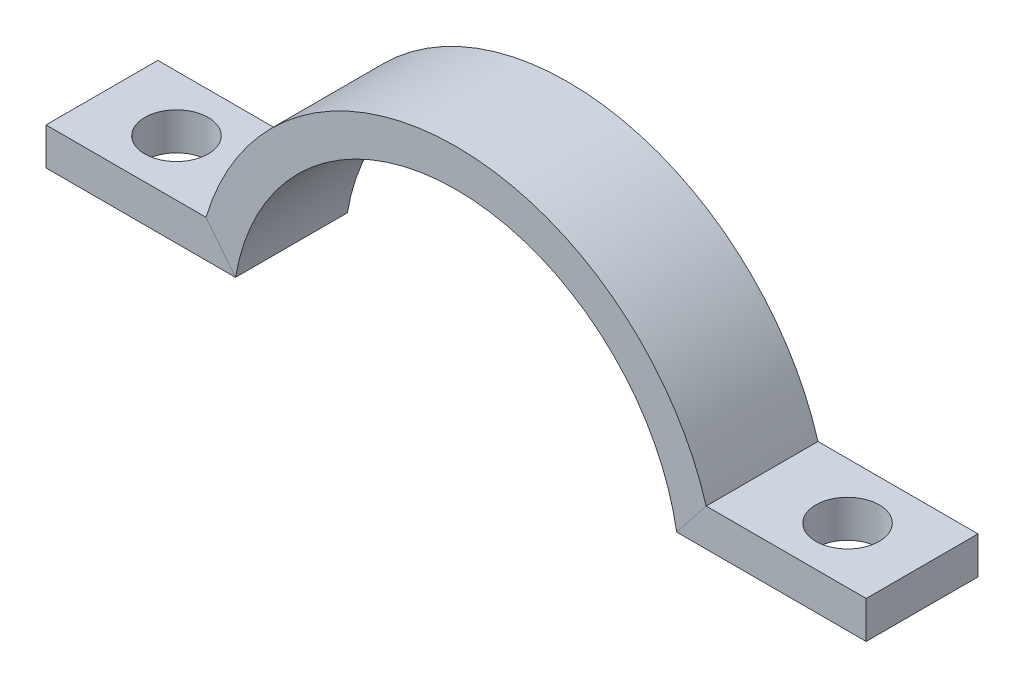
ISO-10303-21;
HEADER;
FILE_DESCRIPTION(('STEP AP214'),'2;1');
FILE_NAME('part.step','',(''),(''),'','','');
FILE_SCHEMA(('AUTOMOTIVE_DESIGN { 1 0 10303 214 1 1 1 1 }'));
ENDSEC;
DATA;
#1=APPLICATION_CONTEXT('core data for automotive mechanical design processes');
#2=APPLICATION_PROTOCOL_DEFINITION('international standard','automotive_design',2000,#1);
#3=PRODUCT_CONTEXT('',#1,'mechanical');
#4=PRODUCT('Part','Part','',(#3));
#5=PRODUCT_RELATED_PRODUCT_CATEGORY('part','',(#4));
#6=PRODUCT_DEFINITION_FORMATION('','',#4);
#7=PRODUCT_DEFINITION_CONTEXT('part definition',#1,'design');
#8=PRODUCT_DEFINITION('design','',#6,#7);
#9=PRODUCT_DEFINITION_SHAPE('','',#8);
#10=(LENGTH_UNIT() NAMED_UNIT(*) SI_UNIT(.MILLI.,.METRE.));
#11=(NAMED_UNIT(*) PLANE_ANGLE_UNIT() SI_UNIT($,.RADIAN.));
#12=(NAMED_UNIT(*) SI_UNIT($,.STERADIAN.) SOLID_ANGLE_UNIT());
#13=UNCERTAINTY_MEASURE_WITH_UNIT(LENGTH_MEASURE(1.E-05),#10,'distance_accuracy_value','');
#14=(GEOMETRIC_REPRESENTATION_CONTEXT(3) GLOBAL_UNCERTAINTY_ASSIGNED_CONTEXT((#13)) GLOBAL_UNIT_ASSIGNED_CONTEXT((#10,
#11,#12)) REPRESENTATION_CONTEXT('',''));
#15=CARTESIAN_POINT('',(0.,0.,0.));
#16=DIRECTION('',(0.,0.,1.));
#17=DIRECTION('',(1.,0.,0.));
#18=AXIS2_PLACEMENT_3D('',#15,#16,#17);
#19=CARTESIAN_POINT('',(22.,0.,0.));
#20=DIRECTION('',(1.,0.,0.));
#21=DIRECTION('',(0.,0.,-1.));
#22=AXIS2_PLACEMENT_3D('',#19,#20,#21);
#23=PLANE('',#22);
#24=DIRECTION('',(0.,-1.,0.));
#25=VECTOR('',#24,1.);
#26=CARTESIAN_POINT('',(22.,2.,3.));
#27=LINE('',#26,#25);
#28=CARTESIAN_POINT('',(22.,4.,3.));
#29=VERTEX_POINT('',#28);
#30=CARTESIAN_POINT('',(22.,2.,3.));
#31=VERTEX_POINT('',#30);
#32=EDGE_CURVE('E82',#29,#31,#27,.T.);
#33=ORIENTED_EDGE('',*,*,#32,.T.);
#34=DIRECTION('',(0.,0.,-1.));
#35=VECTOR('',#34,1.);
#36=CARTESIAN_POINT('',(22.,2.,-3.));
#37=LINE('',#36,#35);
#38=CARTESIAN_POINT('',(22.,2.,-3.));
#39=VERTEX_POINT('',#38);
#40=EDGE_CURVE('E37',#31,#39,#37,.T.);
#41=ORIENTED_EDGE('',*,*,#40,.T.);
#42=DIRECTION('',(0.,1.,0.));
#43=VECTOR('',#42,1.);
#44=CARTESIAN_POINT('',(22.,2.,-3.));
#45=LINE('',#44,#43);
#46=CARTESIAN_POINT('',(22.,4.,-3.));
#47=VERTEX_POINT('',#46);
#48=EDGE_CURVE('E108',#39,#47,#45,.T.);
#49=ORIENTED_EDGE('',*,*,#48,.T.);
#50=DIRECTION('',(0.,0.,1.));
#51=VECTOR('',#50,1.);
#52=CARTESIAN_POINT('',(22.,4.,-3.));
#53=LINE('',#52,#51);
#54=EDGE_CURVE('E80',#47,#29,#53,.T.);
#55=ORIENTED_EDGE('',*,*,#54,.T.);
#56=EDGE_LOOP('',(#33,#41,#49,#55));
#57=FACE_BOUND('',#56,.T.);
#58=ADVANCED_FACE('F34',(#57),#23,.T.);
#59=CARTESIAN_POINT('',(-22.,0.,0.));
#60=DIRECTION('',(1.,0.,0.));
#61=DIRECTION('',(0.,0.,-1.));
#62=AXIS2_PLACEMENT_3D('',#59,#60,#61);
#63=PLANE('',#62);
#64=DIRECTION('',(0.,-1.,0.));
#65=VECTOR('',#64,1.);
#66=CARTESIAN_POINT('',(-22.,1.99999999999999,3.));
#67=LINE('',#66,#65);
#68=CARTESIAN_POINT('',(-22.,3.99999999999999,3.));
#69=VERTEX_POINT('',#68);
#70=CARTESIAN_POINT('',(-22.,1.99999999999999,3.));
#71=VERTEX_POINT('',#70);
#72=EDGE_CURVE('E144',#69,#71,#67,.T.);
#73=ORIENTED_EDGE('',*,*,#72,.F.);
#74=DIRECTION('',(0.,0.,1.));
#75=VECTOR('',#74,1.);
#76=CARTESIAN_POINT('',(-22.,3.99999999999999,-3.));
#77=LINE('',#76,#75);
#78=CARTESIAN_POINT('',(-22.,3.99999999999999,-3.));
#79=VERTEX_POINT('',#78);
#80=EDGE_CURVE('E150',#79,#69,#77,.T.);
#81=ORIENTED_EDGE('',*,*,#80,.F.);
#82=DIRECTION('',(0.,1.,0.));
#83=VECTOR('',#82,1.);
#84=CARTESIAN_POINT('',(-22.,1.99999999999999,-3.));
#85=LINE('',#84,#83);
#86=CARTESIAN_POINT('',(-22.,1.99999999999999,-3.));
#87=VERTEX_POINT('',#86);
#88=EDGE_CURVE('E116',#87,#79,#85,.T.);
#89=ORIENTED_EDGE('',*,*,#88,.F.);
#90=DIRECTION('',(0.,0.,-1.));
#91=VECTOR('',#90,1.);
#92=CARTESIAN_POINT('',(-22.,1.99999999999999,-3.));
#93=LINE('',#92,#91);
#94=EDGE_CURVE('E140',#71,#87,#93,.T.);
#95=ORIENTED_EDGE('',*,*,#94,.F.);
#96=EDGE_LOOP('',(#73,#81,#89,#95));
#97=FACE_BOUND('',#96,.T.);
#98=ADVANCED_FACE('F199',(#97),#63,.F.);
#99=CARTESIAN_POINT('',(11.8321595661992,2.,-3.));
#100=DIRECTION('',(0.,0.,-1.));
#101=DIRECTION('',(0.,1.,0.));
#102=AXIS2_PLACEMENT_3D('',#99,#100,#101);
#103=PLANE('',#102);
#104=DIRECTION('',(-0.620923365895035,-0.783871273670353,0.));
#105=VECTOR('',#104,1.);
#106=CARTESIAN_POINT('',(13.4164078649987,4.,-3.));
#107=LINE('',#106,#105);
#108=CARTESIAN_POINT('',(13.4164078649987,4.,-3.));
#109=VERTEX_POINT('',#108);
#110=CARTESIAN_POINT('',(11.8321595661992,2.00000000000001,-3.));
#111=VERTEX_POINT('',#110);
#112=EDGE_CURVE('E113',#109,#111,#107,.T.);
#113=ORIENTED_EDGE('',*,*,#112,.F.);
#114=DIRECTION('',(1.,0.,0.));
#115=VECTOR('',#114,1.);
#116=CARTESIAN_POINT('',(11.8321595661992,4.,-3.));
#117=LINE('',#116,#115);
#118=EDGE_CURVE('E106',#109,#47,#117,.T.);
#119=ORIENTED_EDGE('',*,*,#118,.T.);
#120=ORIENTED_EDGE('',*,*,#48,.F.);
#121=DIRECTION('',(1.,0.,0.));
#122=VECTOR('',#121,1.);
#123=CARTESIAN_POINT('',(11.8321595661992,2.,-3.));
#124=LINE('',#123,#122);
#125=EDGE_CURVE('E98',#111,#39,#124,.T.);
#126=ORIENTED_EDGE('',*,*,#125,.F.);
#127=EDGE_LOOP('',(#113,#119,#120,#126));
#128=FACE_BOUND('',#127,.T.);
#129=ADVANCED_FACE('F217',(#128),#103,.T.);
#130=CARTESIAN_POINT('',(11.8321595661992,4.,-3.));
#131=DIRECTION('',(0.,1.,0.));
#132=DIRECTION('',(0.,0.,1.));
#133=AXIS2_PLACEMENT_3D('',#130,#131,#132);
#134=PLANE('',#133);
#135=CARTESIAN_POINT('',(18.,3.99999999999999,0.));
#136=DIRECTION('',(0.,1.,0.));
#137=DIRECTION('',(0.,0.,1.));
#138=AXIS2_PLACEMENT_3D('',#135,#136,#137);
#139=CIRCLE('',#138,1.7);
#140=CARTESIAN_POINT('',(18.,3.99999999999999,1.7));
#141=VERTEX_POINT('',#140);
#142=EDGE_CURVE('E164',#141,#141,#139,.T.);
#143=ORIENTED_EDGE('',*,*,#142,.F.);
#144=EDGE_LOOP('',(#143));
#145=FACE_BOUND('',#144,.T.);
#146=ORIENTED_EDGE('',*,*,#118,.F.);
#147=DIRECTION('',(0.,0.,-1.));
#148=VECTOR('',#147,1.);
#149=CARTESIAN_POINT('',(13.4164078649987,4.,0.));
#150=LINE('',#149,#148);
#151=CARTESIAN_POINT('',(13.4164078649987,4.,3.));
#152=VERTEX_POINT('',#151);
#153=EDGE_CURVE('E118',#109,#152,#150,.F.);
#154=ORIENTED_EDGE('',*,*,#153,.T.);
#155=DIRECTION('',(1.,0.,0.));
#156=VECTOR('',#155,1.);
#157=CARTESIAN_POINT('',(11.8321595661992,4.,3.));
#158=LINE('',#157,#156);
#159=EDGE_CURVE('E90',#152,#29,#158,.T.);
#160=ORIENTED_EDGE('',*,*,#159,.T.);
#161=ORIENTED_EDGE('',*,*,#54,.F.);
#162=EDGE_LOOP('',(#146,#154,#160,#161));
#163=FACE_BOUND('',#162,.T.);
#164=ADVANCED_FACE('F220',(#145,#163),#134,.T.);
#165=CARTESIAN_POINT('',(11.8321595661992,2.,3.));
#166=DIRECTION('',(0.,0.,1.));
#167=DIRECTION('',(1.,0.,0.));
#168=AXIS2_PLACEMENT_3D('',#165,#166,#167);
#169=PLANE('',#168);
#170=DIRECTION('',(0.620923365895034,0.783871273670353,0.));
#171=VECTOR('',#170,1.);
#172=CARTESIAN_POINT('',(11.8321595661992,2.00000000000001,3.));
#173=LINE('',#172,#171);
#174=CARTESIAN_POINT('',(11.8321595661992,2.00000000000001,3.));
#175=VERTEX_POINT('',#174);
#176=EDGE_CURVE('E102',#175,#152,#173,.T.);
#177=ORIENTED_EDGE('',*,*,#176,.F.);
#178=DIRECTION('',(1.,0.,0.));
#179=VECTOR('',#178,1.);
#180=CARTESIAN_POINT('',(11.8321595661992,2.,3.));
#181=LINE('',#180,#179);
#182=EDGE_CURVE('E89',#175,#31,#181,.T.);
#183=ORIENTED_EDGE('',*,*,#182,.T.);
#184=ORIENTED_EDGE('',*,*,#32,.F.);
#185=ORIENTED_EDGE('',*,*,#159,.F.);
#186=EDGE_LOOP('',(#177,#183,#184,#185));
#187=FACE_BOUND('',#186,.T.);
#188=ADVANCED_FACE('F100',(#187),#169,.T.);
#189=CARTESIAN_POINT('',(11.8321595661992,2.,-3.));
#190=DIRECTION('',(0.,-1.,0.));
#191=DIRECTION('',(0.,0.,-1.));
#192=AXIS2_PLACEMENT_3D('',#189,#190,#191);
#193=PLANE('',#192);
#194=CARTESIAN_POINT('',(18.,1.99999999999999,0.));
#195=DIRECTION('',(0.,1.,0.));
#196=DIRECTION('',(0.,0.,1.));
#197=AXIS2_PLACEMENT_3D('',#194,#195,#196);
#198=CIRCLE('',#197,1.7);
#199=CARTESIAN_POINT('',(18.,1.99999999999999,1.7));
#200=VERTEX_POINT('',#199);
#201=EDGE_CURVE('E109',#200,#200,#198,.T.);
#202=ORIENTED_EDGE('',*,*,#201,.T.);
#203=EDGE_LOOP('',(#202));
#204=FACE_BOUND('',#203,.T.);
#205=ORIENTED_EDGE('',*,*,#40,.F.);
#206=ORIENTED_EDGE('',*,*,#182,.F.);
#207=DIRECTION('',(0.,0.,-1.));
#208=VECTOR('',#207,1.);
#209=CARTESIAN_POINT('',(11.8321595661992,2.00000000000001,-3.));
#210=LINE('',#209,#208);
#211=EDGE_CURVE('E120',#175,#111,#210,.T.);
#212=ORIENTED_EDGE('',*,*,#211,.T.);
#213=ORIENTED_EDGE('',*,*,#125,.T.);
#214=EDGE_LOOP('',(#205,#206,#212,#213));
#215=FACE_BOUND('',#214,.T.);
#216=ADVANCED_FACE('F95',(#204,#215),#193,.T.);
#217=CARTESIAN_POINT('',(0.,0.,0.));
#218=DIRECTION('',(0.,0.,-1.));
#219=DIRECTION('',(-1.,0.,0.));
#220=AXIS2_PLACEMENT_3D('',#217,#218,#219);
#221=CYLINDRICAL_SURFACE('',#220,14.);
#222=ORIENTED_EDGE('',*,*,#153,.F.);
#223=CARTESIAN_POINT('',(0.,0.,-3.));
#224=DIRECTION('',(0.,0.,-1.));
#225=DIRECTION('',(-0.986013297183269,0.166666666666666,0.));
#226=AXIS2_PLACEMENT_3D('',#223,#224,#225);
#227=CIRCLE('',#226,14.);
#228=CARTESIAN_POINT('',(-13.4164078649987,3.99999999999999,-3.));
#229=VERTEX_POINT('',#228);
#230=EDGE_CURVE('E128',#229,#109,#227,.T.);
#231=ORIENTED_EDGE('',*,*,#230,.F.);
#232=DIRECTION('',(0.,0.,-1.));
#233=VECTOR('',#232,1.);
#234=CARTESIAN_POINT('',(-13.4164078649987,3.99999999999999,0.));
#235=LINE('',#234,#233);
#236=CARTESIAN_POINT('',(-13.4164078649987,3.99999999999999,3.));
#237=VERTEX_POINT('',#236);
#238=EDGE_CURVE('E134',#229,#237,#235,.F.);
#239=ORIENTED_EDGE('',*,*,#238,.T.);
#240=CARTESIAN_POINT('',(0.,0.,3.));
#241=DIRECTION('',(0.,0.,-1.));
#242=DIRECTION('',(-0.986013297183269,0.166666666666666,0.));
#243=AXIS2_PLACEMENT_3D('',#240,#241,#242);
#244=CIRCLE('',#243,14.);
#245=EDGE_CURVE('E125',#237,#152,#244,.T.);
#246=ORIENTED_EDGE('',*,*,#245,.T.);
#247=EDGE_LOOP('',(#222,#231,#239,#246));
#248=FACE_BOUND('',#247,.T.);
#249=ADVANCED_FACE('F221',(#248),#221,.T.);
#250=CARTESIAN_POINT('',(0.,0.,0.));
#251=DIRECTION('',(0.,0.,-1.));
#252=DIRECTION('',(-1.,0.,0.));
#253=AXIS2_PLACEMENT_3D('',#250,#251,#252);
#254=CYLINDRICAL_SURFACE('',#253,12.);
#255=ORIENTED_EDGE('',*,*,#211,.F.);
#256=CARTESIAN_POINT('',(0.,0.,3.));
#257=DIRECTION('',(0.,0.,-1.));
#258=DIRECTION('',(-0.986013297183269,0.166666666666666,0.));
#259=AXIS2_PLACEMENT_3D('',#256,#257,#258);
#260=CIRCLE('',#259,12.);
#261=CARTESIAN_POINT('',(-11.8321595661992,1.99999999999999,3.));
#262=VERTEX_POINT('',#261);
#263=EDGE_CURVE('E122',#262,#175,#260,.T.);
#264=ORIENTED_EDGE('',*,*,#263,.F.);
#265=DIRECTION('',(0.,0.,-1.));
#266=VECTOR('',#265,1.);
#267=CARTESIAN_POINT('',(-11.8321595661992,1.99999999999999,-3.));
#268=LINE('',#267,#266);
#269=CARTESIAN_POINT('',(-11.8321595661992,1.99999999999999,-3.));
#270=VERTEX_POINT('',#269);
#271=EDGE_CURVE('E136',#262,#270,#268,.T.);
#272=ORIENTED_EDGE('',*,*,#271,.T.);
#273=CARTESIAN_POINT('',(0.,0.,-3.));
#274=DIRECTION('',(0.,0.,-1.));
#275=DIRECTION('',(-0.986013297183269,0.166666666666666,0.));
#276=AXIS2_PLACEMENT_3D('',#273,#274,#275);
#277=CIRCLE('',#276,12.);
#278=EDGE_CURVE('E99',#270,#111,#277,.T.);
#279=ORIENTED_EDGE('',*,*,#278,.T.);
#280=EDGE_LOOP('',(#255,#264,#272,#279));
#281=FACE_BOUND('',#280,.T.);
#282=ADVANCED_FACE('F214',(#281),#254,.F.);
#283=CARTESIAN_POINT('',(-11.8321595661992,1.99999999999999,3.));
#284=DIRECTION('',(0.,0.,1.));
#285=DIRECTION('',(1.,0.,0.));
#286=AXIS2_PLACEMENT_3D('',#283,#284,#285);
#287=PLANE('',#286);
#288=ORIENTED_EDGE('',*,*,#263,.T.);
#289=ORIENTED_EDGE('',*,*,#176,.T.);
#290=ORIENTED_EDGE('',*,*,#245,.F.);
#291=DIRECTION('',(-0.62092336589503,0.783871273670357,0.));
#292=VECTOR('',#291,1.);
#293=CARTESIAN_POINT('',(-11.8321595661992,1.99999999999999,3.));
#294=LINE('',#293,#292);
#295=EDGE_CURVE('E43',#262,#237,#294,.T.);
#296=ORIENTED_EDGE('',*,*,#295,.F.);
#297=EDGE_LOOP('',(#288,#289,#290,#296));
#298=FACE_BOUND('',#297,.T.);
#299=ADVANCED_FACE('F222',(#298),#287,.T.);
#300=CARTESIAN_POINT('',(-11.8321595661992,1.99999999999999,-3.));
#301=DIRECTION('',(0.,0.,-1.));
#302=DIRECTION('',(-1.,0.,0.));
#303=AXIS2_PLACEMENT_3D('',#300,#301,#302);
#304=PLANE('',#303);
#305=ORIENTED_EDGE('',*,*,#230,.T.);
#306=ORIENTED_EDGE('',*,*,#112,.T.);
#307=ORIENTED_EDGE('',*,*,#278,.F.);
#308=DIRECTION('',(0.620923365895029,-0.783871273670357,0.));
#309=VECTOR('',#308,1.);
#310=CARTESIAN_POINT('',(-13.4164078649987,3.99999999999999,-3.));
#311=LINE('',#310,#309);
#312=EDGE_CURVE('E11',#229,#270,#311,.T.);
#313=ORIENTED_EDGE('',*,*,#312,.F.);
#314=EDGE_LOOP('',(#305,#306,#307,#313));
#315=FACE_BOUND('',#314,.T.);
#316=ADVANCED_FACE('F180',(#315),#304,.T.);
#317=CARTESIAN_POINT('',(-22.,3.99999999999999,-3.));
#318=DIRECTION('',(0.,1.,0.));
#319=DIRECTION('',(0.,0.,1.));
#320=AXIS2_PLACEMENT_3D('',#317,#318,#319);
#321=PLANE('',#320);
#322=CARTESIAN_POINT('',(-18.,3.99999999999999,0.));
#323=DIRECTION('',(0.,1.,0.));
#324=DIRECTION('',(0.,0.,1.));
#325=AXIS2_PLACEMENT_3D('',#322,#323,#324);
#326=CIRCLE('',#325,1.7);
#327=CARTESIAN_POINT('',(-18.,3.99999999999999,1.7));
#328=VERTEX_POINT('',#327);
#329=EDGE_CURVE('E170',#328,#328,#326,.T.);
#330=ORIENTED_EDGE('',*,*,#329,.F.);
#331=EDGE_LOOP('',(#330));
#332=FACE_BOUND('',#331,.T.);
#333=ORIENTED_EDGE('',*,*,#238,.F.);
#334=DIRECTION('',(1.,0.,0.));
#335=VECTOR('',#334,1.);
#336=CARTESIAN_POINT('',(-22.,3.99999999999999,-3.));
#337=LINE('',#336,#335);
#338=EDGE_CURVE('E153',#79,#229,#337,.T.);
#339=ORIENTED_EDGE('',*,*,#338,.F.);
#340=ORIENTED_EDGE('',*,*,#80,.T.);
#341=DIRECTION('',(1.,0.,0.));
#342=VECTOR('',#341,1.);
#343=CARTESIAN_POINT('',(-22.,3.99999999999999,3.));
#344=LINE('',#343,#342);
#345=EDGE_CURVE('E147',#69,#237,#344,.T.);
#346=ORIENTED_EDGE('',*,*,#345,.T.);
#347=EDGE_LOOP('',(#333,#339,#340,#346));
#348=FACE_BOUND('',#347,.T.);
#349=ADVANCED_FACE('F176',(#332,#348),#321,.T.);
#350=CARTESIAN_POINT('',(-22.,1.99999999999999,-3.));
#351=DIRECTION('',(0.,-1.,0.));
#352=DIRECTION('',(0.,0.,-1.));
#353=AXIS2_PLACEMENT_3D('',#350,#351,#352);
#354=PLANE('',#353);
#355=CARTESIAN_POINT('',(-18.,1.99999999999999,0.));
#356=DIRECTION('',(0.,1.,0.));
#357=DIRECTION('',(0.,0.,1.));
#358=AXIS2_PLACEMENT_3D('',#355,#356,#357);
#359=CIRCLE('',#358,1.7);
#360=CARTESIAN_POINT('',(-18.,1.99999999999999,1.7));
#361=VERTEX_POINT('',#360);
#362=EDGE_CURVE('E167',#361,#361,#359,.T.);
#363=ORIENTED_EDGE('',*,*,#362,.T.);
#364=EDGE_LOOP('',(#363));
#365=FACE_BOUND('',#364,.T.);
#366=ORIENTED_EDGE('',*,*,#271,.F.);
#367=DIRECTION('',(1.,0.,0.));
#368=VECTOR('',#367,1.);
#369=CARTESIAN_POINT('',(-22.,1.99999999999999,3.));
#370=LINE('',#369,#368);
#371=EDGE_CURVE('E139',#71,#262,#370,.T.);
#372=ORIENTED_EDGE('',*,*,#371,.F.);
#373=ORIENTED_EDGE('',*,*,#94,.T.);
#374=DIRECTION('',(1.,0.,0.));
#375=VECTOR('',#374,1.);
#376=CARTESIAN_POINT('',(-22.,1.99999999999999,-3.));
#377=LINE('',#376,#375);
#378=EDGE_CURVE('E143',#87,#270,#377,.T.);
#379=ORIENTED_EDGE('',*,*,#378,.T.);
#380=EDGE_LOOP('',(#366,#372,#373,#379));
#381=FACE_BOUND('',#380,.T.);
#382=ADVANCED_FACE('F179',(#365,#381),#354,.T.);
#383=CARTESIAN_POINT('',(-22.,1.99999999999999,3.));
#384=DIRECTION('',(0.,0.,1.));
#385=DIRECTION('',(1.,0.,0.));
#386=AXIS2_PLACEMENT_3D('',#383,#384,#385);
#387=PLANE('',#386);
#388=ORIENTED_EDGE('',*,*,#371,.T.);
#389=ORIENTED_EDGE('',*,*,#295,.T.);
#390=ORIENTED_EDGE('',*,*,#345,.F.);
#391=ORIENTED_EDGE('',*,*,#72,.T.);
#392=EDGE_LOOP('',(#388,#389,#390,#391));
#393=FACE_BOUND('',#392,.T.);
#394=ADVANCED_FACE('F207',(#393),#387,.T.);
#395=CARTESIAN_POINT('',(-22.,1.99999999999999,-3.));
#396=DIRECTION('',(0.,0.,-1.));
#397=DIRECTION('',(0.,1.,0.));
#398=AXIS2_PLACEMENT_3D('',#395,#396,#397);
#399=PLANE('',#398);
#400=ORIENTED_EDGE('',*,*,#338,.T.);
#401=ORIENTED_EDGE('',*,*,#312,.T.);
#402=ORIENTED_EDGE('',*,*,#378,.F.);
#403=ORIENTED_EDGE('',*,*,#88,.T.);
#404=EDGE_LOOP('',(#400,#401,#402,#403));
#405=FACE_BOUND('',#404,.T.);
#406=ADVANCED_FACE('F189',(#405),#399,.T.);
#407=CARTESIAN_POINT('',(18.,3.99999999999999,0.));
#408=DIRECTION('',(0.,1.,0.));
#409=DIRECTION('',(0.,0.,1.));
#410=AXIS2_PLACEMENT_3D('',#407,#408,#409);
#411=CYLINDRICAL_SURFACE('',#410,1.7);
#412=ORIENTED_EDGE('',*,*,#201,.F.);
#413=EDGE_LOOP('',(#412));
#414=FACE_BOUND('',#413,.T.);
#415=ORIENTED_EDGE('',*,*,#142,.T.);
#416=EDGE_LOOP('',(#415));
#417=FACE_BOUND('',#416,.T.);
#418=ADVANCED_FACE('F233',(#414,#417),#411,.F.);
#419=CARTESIAN_POINT('',(-18.,3.99999999999999,0.));
#420=DIRECTION('',(0.,1.,0.));
#421=DIRECTION('',(0.,0.,1.));
#422=AXIS2_PLACEMENT_3D('',#419,#420,#421);
#423=CYLINDRICAL_SURFACE('',#422,1.7);
#424=ORIENTED_EDGE('',*,*,#362,.F.);
#425=EDGE_LOOP('',(#424));
#426=FACE_BOUND('',#425,.T.);
#427=ORIENTED_EDGE('',*,*,#329,.T.);
#428=EDGE_LOOP('',(#427));
#429=FACE_BOUND('',#428,.T.);
#430=ADVANCED_FACE('F174',(#426,#429),#423,.F.);
#431=CLOSED_SHELL('',(#58,#98,#129,#164,#188,#216,#249,#282,#299,#316,#349,#382,#394,#406,#418,#430));
#432=MANIFOLD_SOLID_BREP('B2',#431);
#433=ADVANCED_BREP_SHAPE_REPRESENTATION('',(#18,#432),#14);
#434=SHAPE_DEFINITION_REPRESENTATION(#9,#433);
ENDSEC;
END-ISO-10303-21;
